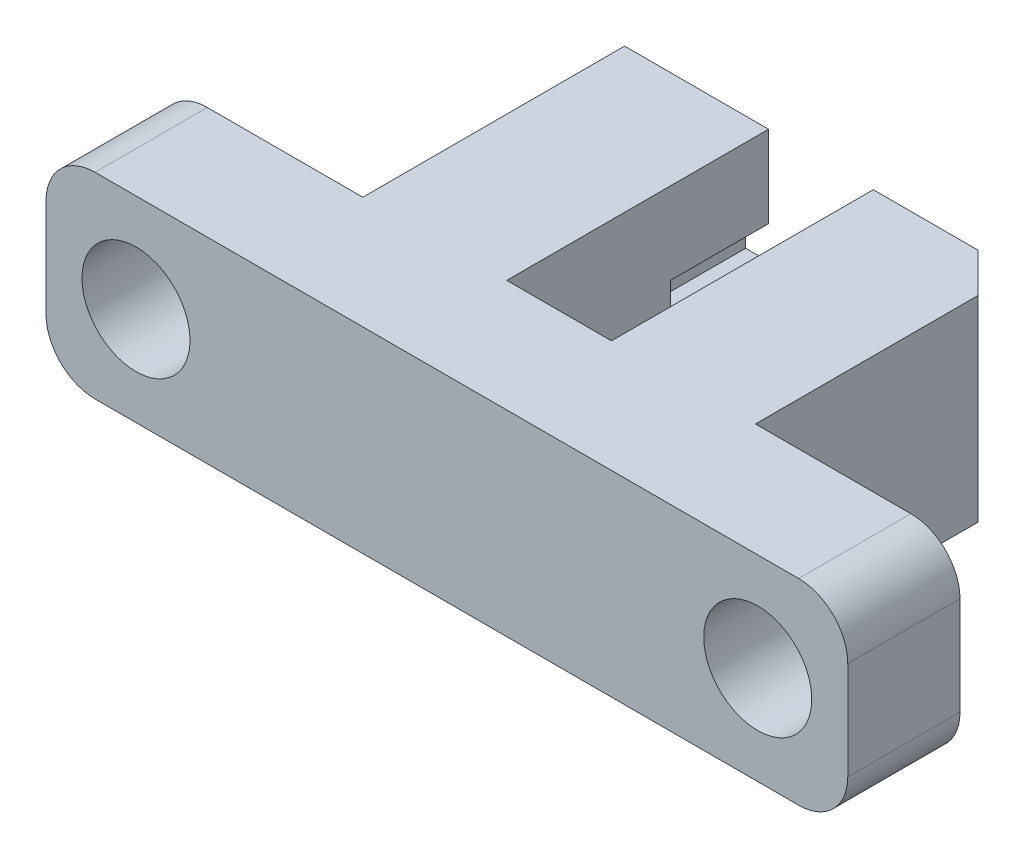
ISO-10303-21;
HEADER;
FILE_DESCRIPTION(('STEP AP214'),'2;1');
FILE_NAME('part.step','',(''),(''),'','','');
FILE_SCHEMA(('AUTOMOTIVE_DESIGN { 1 0 10303 214 1 1 1 1 }'));
ENDSEC;
DATA;
#1=APPLICATION_CONTEXT('core data for automotive mechanical design processes');
#2=APPLICATION_PROTOCOL_DEFINITION('international standard','automotive_design',2000,#1);
#3=PRODUCT_CONTEXT('',#1,'mechanical');
#4=PRODUCT('Part','Part','',(#3));
#5=PRODUCT_RELATED_PRODUCT_CATEGORY('part','',(#4));
#6=PRODUCT_DEFINITION_FORMATION('','',#4);
#7=PRODUCT_DEFINITION_CONTEXT('part definition',#1,'design');
#8=PRODUCT_DEFINITION('design','',#6,#7);
#9=PRODUCT_DEFINITION_SHAPE('','',#8);
#10=(LENGTH_UNIT() NAMED_UNIT(*) SI_UNIT(.MILLI.,.METRE.));
#11=(NAMED_UNIT(*) PLANE_ANGLE_UNIT() SI_UNIT($,.RADIAN.));
#12=(NAMED_UNIT(*) SI_UNIT($,.STERADIAN.) SOLID_ANGLE_UNIT());
#13=UNCERTAINTY_MEASURE_WITH_UNIT(LENGTH_MEASURE(1.E-05),#10,'distance_accuracy_value','');
#14=(GEOMETRIC_REPRESENTATION_CONTEXT(3) GLOBAL_UNCERTAINTY_ASSIGNED_CONTEXT((#13)) GLOBAL_UNIT_ASSIGNED_CONTEXT((#10,
#11,#12)) REPRESENTATION_CONTEXT('',''));
#15=CARTESIAN_POINT('',(0.,0.,0.));
#16=DIRECTION('',(0.,0.,1.));
#17=DIRECTION('',(1.,0.,0.));
#18=AXIS2_PLACEMENT_3D('',#15,#16,#17);
#19=CARTESIAN_POINT('',(6.15,-0.5,-11.43));
#20=DIRECTION('',(1.,0.,0.));
#21=DIRECTION('',(0.,0.,-1.));
#22=AXIS2_PLACEMENT_3D('',#19,#20,#21);
#23=PLANE('',#22);
#24=DIRECTION('',(0.,0.,-1.));
#25=VECTOR('',#24,1.);
#26=CARTESIAN_POINT('',(6.15,-0.5,-11.43));
#27=LINE('',#26,#25);
#28=CARTESIAN_POINT('',(6.15,-0.5,-11.43));
#29=VERTEX_POINT('',#28);
#30=CARTESIAN_POINT('',(6.15,-0.5,-8.43));
#31=VERTEX_POINT('',#30);
#32=EDGE_CURVE('E409',#29,#31,#27,.F.);
#33=ORIENTED_EDGE('',*,*,#32,.T.);
#34=DIRECTION('',(0.,1.,0.));
#35=VECTOR('',#34,1.);
#36=CARTESIAN_POINT('',(6.15,-0.5,-8.43));
#37=LINE('',#36,#35);
#38=CARTESIAN_POINT('',(6.15,0.5,-8.43));
#39=VERTEX_POINT('',#38);
#40=EDGE_CURVE('E440',#39,#31,#37,.F.);
#41=ORIENTED_EDGE('',*,*,#40,.F.);
#42=DIRECTION('',(0.,0.,1.));
#43=VECTOR('',#42,1.);
#44=CARTESIAN_POINT('',(6.15,0.5,-11.43));
#45=LINE('',#44,#43);
#46=CARTESIAN_POINT('',(6.15,0.5,-11.43));
#47=VERTEX_POINT('',#46);
#48=EDGE_CURVE('E393',#39,#47,#45,.F.);
#49=ORIENTED_EDGE('',*,*,#48,.T.);
#50=DIRECTION('',(0.,1.,0.));
#51=VECTOR('',#50,1.);
#52=CARTESIAN_POINT('',(6.15,-0.5,-11.43));
#53=LINE('',#52,#51);
#54=EDGE_CURVE('E433',#29,#47,#53,.T.);
#55=ORIENTED_EDGE('',*,*,#54,.F.);
#56=EDGE_LOOP('',(#33,#41,#49,#55));
#57=FACE_BOUND('',#56,.T.);
#58=ADVANCED_FACE('F16',(#57),#23,.F.);
#59=CARTESIAN_POINT('',(1.55,0.5,-11.43));
#60=DIRECTION('',(-1.,0.,0.));
#61=DIRECTION('',(0.,0.,1.));
#62=AXIS2_PLACEMENT_3D('',#59,#60,#61);
#63=PLANE('',#62);
#64=DIRECTION('',(0.,0.,1.));
#65=VECTOR('',#64,1.);
#66=CARTESIAN_POINT('',(1.55,0.5,-11.43));
#67=LINE('',#66,#65);
#68=CARTESIAN_POINT('',(1.55,0.5,-11.43));
#69=VERTEX_POINT('',#68);
#70=CARTESIAN_POINT('',(1.55,0.5,-8.43));
#71=VERTEX_POINT('',#70);
#72=EDGE_CURVE('E354',#69,#71,#67,.T.);
#73=ORIENTED_EDGE('',*,*,#72,.T.);
#74=DIRECTION('',(0.,1.,0.));
#75=VECTOR('',#74,1.);
#76=CARTESIAN_POINT('',(1.55,0.5,-8.43));
#77=LINE('',#76,#75);
#78=CARTESIAN_POINT('',(1.55,-0.5,-8.43));
#79=VERTEX_POINT('',#78);
#80=EDGE_CURVE('E431',#79,#71,#77,.T.);
#81=ORIENTED_EDGE('',*,*,#80,.F.);
#82=DIRECTION('',(0.,0.,-1.));
#83=VECTOR('',#82,1.);
#84=CARTESIAN_POINT('',(1.55,-0.5,-11.43));
#85=LINE('',#84,#83);
#86=CARTESIAN_POINT('',(1.55,-0.5,-11.43));
#87=VERTEX_POINT('',#86);
#88=EDGE_CURVE('E337',#79,#87,#85,.T.);
#89=ORIENTED_EDGE('',*,*,#88,.T.);
#90=DIRECTION('',(0.,1.,0.));
#91=VECTOR('',#90,1.);
#92=CARTESIAN_POINT('',(1.55,0.5,-11.43));
#93=LINE('',#92,#91);
#94=EDGE_CURVE('E414',#69,#87,#93,.F.);
#95=ORIENTED_EDGE('',*,*,#94,.F.);
#96=EDGE_LOOP('',(#73,#81,#89,#95));
#97=FACE_BOUND('',#96,.T.);
#98=ADVANCED_FACE('F604',(#97),#63,.F.);
#99=CARTESIAN_POINT('',(5.45,-0.5,-11.43));
#100=DIRECTION('',(0.,-1.,0.));
#101=DIRECTION('',(0.,0.,-1.));
#102=AXIS2_PLACEMENT_3D('',#99,#100,#101);
#103=PLANE('',#102);
#104=DIRECTION('',(0.,0.,1.));
#105=VECTOR('',#104,1.);
#106=CARTESIAN_POINT('',(5.45,-0.5,-3.43));
#107=LINE('',#106,#105);
#108=CARTESIAN_POINT('',(5.45,-0.5,-8.43));
#109=VERTEX_POINT('',#108);
#110=CARTESIAN_POINT('',(5.45,-0.5,-11.43));
#111=VERTEX_POINT('',#110);
#112=EDGE_CURVE('E375',#109,#111,#107,.F.);
#113=ORIENTED_EDGE('',*,*,#112,.F.);
#114=DIRECTION('',(1.,0.,0.));
#115=VECTOR('',#114,1.);
#116=CARTESIAN_POINT('',(5.8,-0.5,-8.43));
#117=LINE('',#116,#115);
#118=EDGE_CURVE('E389',#109,#31,#117,.T.);
#119=ORIENTED_EDGE('',*,*,#118,.T.);
#120=ORIENTED_EDGE('',*,*,#32,.F.);
#121=DIRECTION('',(-1.,0.,0.));
#122=VECTOR('',#121,1.);
#123=CARTESIAN_POINT('',(7.65,-0.5,-11.43));
#124=LINE('',#123,#122);
#125=EDGE_CURVE('E200',#111,#29,#124,.F.);
#126=ORIENTED_EDGE('',*,*,#125,.F.);
#127=EDGE_LOOP('',(#113,#119,#120,#126));
#128=FACE_BOUND('',#127,.T.);
#129=ADVANCED_FACE('F606',(#128),#103,.F.);
#130=CARTESIAN_POINT('',(6.15,0.5,-11.43));
#131=DIRECTION('',(0.,1.,0.));
#132=DIRECTION('',(-1.,0.,0.));
#133=AXIS2_PLACEMENT_3D('',#130,#131,#132);
#134=PLANE('',#133);
#135=ORIENTED_EDGE('',*,*,#48,.F.);
#136=DIRECTION('',(1.,0.,0.));
#137=VECTOR('',#136,1.);
#138=CARTESIAN_POINT('',(5.8,0.5,-8.43));
#139=LINE('',#138,#137);
#140=CARTESIAN_POINT('',(5.45,0.5,-8.43));
#141=VERTEX_POINT('',#140);
#142=EDGE_CURVE('E392',#39,#141,#139,.F.);
#143=ORIENTED_EDGE('',*,*,#142,.T.);
#144=DIRECTION('',(0.,0.,1.));
#145=VECTOR('',#144,1.);
#146=CARTESIAN_POINT('',(5.45,0.5,-3.43));
#147=LINE('',#146,#145);
#148=CARTESIAN_POINT('',(5.45,0.5,-11.43));
#149=VERTEX_POINT('',#148);
#150=EDGE_CURVE('E273',#149,#141,#147,.T.);
#151=ORIENTED_EDGE('',*,*,#150,.F.);
#152=DIRECTION('',(-1.,0.,0.));
#153=VECTOR('',#152,1.);
#154=CARTESIAN_POINT('',(7.65,0.5,-11.43));
#155=LINE('',#154,#153);
#156=EDGE_CURVE('E286',#47,#149,#155,.T.);
#157=ORIENTED_EDGE('',*,*,#156,.F.);
#158=EDGE_LOOP('',(#135,#143,#151,#157));
#159=FACE_BOUND('',#158,.T.);
#160=ADVANCED_FACE('F611',(#159),#134,.F.);
#161=CARTESIAN_POINT('',(5.8,0.,-8.43));
#162=DIRECTION('',(0.,0.,1.));
#163=DIRECTION('',(1.,0.,0.));
#164=AXIS2_PLACEMENT_3D('',#161,#162,#163);
#165=PLANE('',#164);
#166=ORIENTED_EDGE('',*,*,#142,.F.);
#167=ORIENTED_EDGE('',*,*,#40,.T.);
#168=ORIENTED_EDGE('',*,*,#118,.F.);
#169=DIRECTION('',(0.,1.,0.));
#170=VECTOR('',#169,1.);
#171=CARTESIAN_POINT('',(5.45,-3.,-8.43));
#172=LINE('',#171,#170);
#173=EDGE_CURVE('E348',#141,#109,#172,.F.);
#174=ORIENTED_EDGE('',*,*,#173,.F.);
#175=EDGE_LOOP('',(#166,#167,#168,#174));
#176=FACE_BOUND('',#175,.T.);
#177=ADVANCED_FACE('F618',(#176),#165,.F.);
#178=CARTESIAN_POINT('',(2.25,0.5,-11.43));
#179=DIRECTION('',(0.,1.,0.));
#180=DIRECTION('',(-1.,0.,0.));
#181=AXIS2_PLACEMENT_3D('',#178,#179,#180);
#182=PLANE('',#181);
#183=DIRECTION('',(0.,0.,-1.));
#184=VECTOR('',#183,1.);
#185=CARTESIAN_POINT('',(2.25,0.5,-3.43));
#186=LINE('',#185,#184);
#187=CARTESIAN_POINT('',(2.25,0.5,-8.43));
#188=VERTEX_POINT('',#187);
#189=CARTESIAN_POINT('',(2.25,0.5,-11.43));
#190=VERTEX_POINT('',#189);
#191=EDGE_CURVE('E252',#188,#190,#186,.T.);
#192=ORIENTED_EDGE('',*,*,#191,.F.);
#193=DIRECTION('',(1.,0.,0.));
#194=VECTOR('',#193,1.);
#195=CARTESIAN_POINT('',(1.9,0.5,-8.43));
#196=LINE('',#195,#194);
#197=EDGE_CURVE('E305',#188,#71,#196,.F.);
#198=ORIENTED_EDGE('',*,*,#197,.T.);
#199=ORIENTED_EDGE('',*,*,#72,.F.);
#200=DIRECTION('',(-1.,0.,0.));
#201=VECTOR('',#200,1.);
#202=CARTESIAN_POINT('',(2.25,0.5,-11.43));
#203=LINE('',#202,#201);
#204=EDGE_CURVE('E351',#190,#69,#203,.T.);
#205=ORIENTED_EDGE('',*,*,#204,.F.);
#206=EDGE_LOOP('',(#192,#198,#199,#205));
#207=FACE_BOUND('',#206,.T.);
#208=ADVANCED_FACE('F602',(#207),#182,.F.);
#209=CARTESIAN_POINT('',(1.55,-0.5,-11.43));
#210=DIRECTION('',(0.,-1.,0.));
#211=DIRECTION('',(0.,0.,-1.));
#212=AXIS2_PLACEMENT_3D('',#209,#210,#211);
#213=PLANE('',#212);
#214=ORIENTED_EDGE('',*,*,#88,.F.);
#215=DIRECTION('',(1.,0.,0.));
#216=VECTOR('',#215,1.);
#217=CARTESIAN_POINT('',(1.9,-0.5,-8.43));
#218=LINE('',#217,#216);
#219=CARTESIAN_POINT('',(2.25,-0.5,-8.43));
#220=VERTEX_POINT('',#219);
#221=EDGE_CURVE('E336',#79,#220,#218,.T.);
#222=ORIENTED_EDGE('',*,*,#221,.T.);
#223=DIRECTION('',(0.,0.,-1.));
#224=VECTOR('',#223,1.);
#225=CARTESIAN_POINT('',(2.25,-0.5,-3.43));
#226=LINE('',#225,#224);
#227=CARTESIAN_POINT('',(2.25,-0.5,-11.43));
#228=VERTEX_POINT('',#227);
#229=EDGE_CURVE('E327',#228,#220,#226,.F.);
#230=ORIENTED_EDGE('',*,*,#229,.F.);
#231=DIRECTION('',(1.,0.,0.));
#232=VECTOR('',#231,1.);
#233=CARTESIAN_POINT('',(1.55,-0.5,-11.43));
#234=LINE('',#233,#232);
#235=EDGE_CURVE('E334',#87,#228,#234,.T.);
#236=ORIENTED_EDGE('',*,*,#235,.F.);
#237=EDGE_LOOP('',(#214,#222,#230,#236));
#238=FACE_BOUND('',#237,.T.);
#239=ADVANCED_FACE('F595',(#238),#213,.F.);
#240=CARTESIAN_POINT('',(1.9,0.,-8.43));
#241=DIRECTION('',(0.,0.,1.));
#242=DIRECTION('',(1.,0.,0.));
#243=AXIS2_PLACEMENT_3D('',#240,#241,#242);
#244=PLANE('',#243);
#245=DIRECTION('',(0.,1.,0.));
#246=VECTOR('',#245,1.);
#247=CARTESIAN_POINT('',(2.25,3.,-8.43));
#248=LINE('',#247,#246);
#249=EDGE_CURVE('E323',#220,#188,#248,.T.);
#250=ORIENTED_EDGE('',*,*,#249,.F.);
#251=ORIENTED_EDGE('',*,*,#221,.F.);
#252=ORIENTED_EDGE('',*,*,#80,.T.);
#253=ORIENTED_EDGE('',*,*,#197,.F.);
#254=EDGE_LOOP('',(#250,#251,#252,#253));
#255=FACE_BOUND('',#254,.T.);
#256=ADVANCED_FACE('F599',(#255),#244,.F.);
#257=CARTESIAN_POINT('',(-8.4,-3.,0.));
#258=DIRECTION('',(-1.,0.,0.));
#259=DIRECTION('',(0.,0.,1.));
#260=AXIS2_PLACEMENT_3D('',#257,#258,#259);
#261=PLANE('',#260);
#262=DIRECTION('',(0.,0.,-1.));
#263=VECTOR('',#262,1.);
#264=CARTESIAN_POINT('',(-8.4,1.5,0.));
#265=LINE('',#264,#263);
#266=CARTESIAN_POINT('',(-8.4,1.5,-3.43));
#267=VERTEX_POINT('',#266);
#268=CARTESIAN_POINT('',(-8.4,1.5,0.));
#269=VERTEX_POINT('',#268);
#270=EDGE_CURVE('E306',#267,#269,#265,.F.);
#271=ORIENTED_EDGE('',*,*,#270,.F.);
#272=DIRECTION('',(0.,1.,0.));
#273=VECTOR('',#272,1.);
#274=CARTESIAN_POINT('',(-8.4,0.,-3.43));
#275=LINE('',#274,#273);
#276=CARTESIAN_POINT('',(-8.4,-1.5,-3.43));
#277=VERTEX_POINT('',#276);
#278=EDGE_CURVE('E178',#267,#277,#275,.F.);
#279=ORIENTED_EDGE('',*,*,#278,.T.);
#280=DIRECTION('',(0.,0.,-1.));
#281=VECTOR('',#280,1.);
#282=CARTESIAN_POINT('',(-8.4,-1.5,0.));
#283=LINE('',#282,#281);
#284=CARTESIAN_POINT('',(-8.4,-1.5,0.));
#285=VERTEX_POINT('',#284);
#286=EDGE_CURVE('E188',#285,#277,#283,.T.);
#287=ORIENTED_EDGE('',*,*,#286,.F.);
#288=DIRECTION('',(0.,1.,0.));
#289=VECTOR('',#288,1.);
#290=CARTESIAN_POINT('',(-8.4,0.,0.));
#291=LINE('',#290,#289);
#292=EDGE_CURVE('E471',#269,#285,#291,.F.);
#293=ORIENTED_EDGE('',*,*,#292,.F.);
#294=EDGE_LOOP('',(#271,#279,#287,#293));
#295=FACE_BOUND('',#294,.T.);
#296=ADVANCED_FACE('F629',(#295),#261,.T.);
#297=CARTESIAN_POINT('',(-6.9,-1.5,0.));
#298=DIRECTION('',(0.,0.,-1.));
#299=DIRECTION('',(-1.,0.,0.));
#300=AXIS2_PLACEMENT_3D('',#297,#298,#299);
#301=CYLINDRICAL_SURFACE('',#300,1.5);
#302=CARTESIAN_POINT('',(-6.9,-1.5,0.));
#303=DIRECTION('',(0.,0.,-1.));
#304=DIRECTION('',(-1.,0.,0.));
#305=AXIS2_PLACEMENT_3D('',#302,#303,#304);
#306=CIRCLE('',#305,1.5);
#307=CARTESIAN_POINT('',(-6.9,-3.,0.));
#308=VERTEX_POINT('',#307);
#309=EDGE_CURVE('E469',#285,#308,#306,.F.);
#310=ORIENTED_EDGE('',*,*,#309,.F.);
#311=ORIENTED_EDGE('',*,*,#286,.T.);
#312=CARTESIAN_POINT('',(-6.9,-1.5,-3.43));
#313=DIRECTION('',(0.,0.,-1.));
#314=DIRECTION('',(-1.,0.,0.));
#315=AXIS2_PLACEMENT_3D('',#312,#313,#314);
#316=CIRCLE('',#315,1.5);
#317=CARTESIAN_POINT('',(-6.9,-3.,-3.43));
#318=VERTEX_POINT('',#317);
#319=EDGE_CURVE('E19',#277,#318,#316,.F.);
#320=ORIENTED_EDGE('',*,*,#319,.T.);
#321=DIRECTION('',(0.,0.,-1.));
#322=VECTOR('',#321,1.);
#323=CARTESIAN_POINT('',(-6.9,-3.,0.));
#324=LINE('',#323,#322);
#325=EDGE_CURVE('E186',#308,#318,#324,.T.);
#326=ORIENTED_EDGE('',*,*,#325,.F.);
#327=EDGE_LOOP('',(#310,#311,#320,#326));
#328=FACE_BOUND('',#327,.T.);
#329=ADVANCED_FACE('F185',(#328),#301,.T.);
#330=CARTESIAN_POINT('',(-5.65,0.,0.));
#331=DIRECTION('',(0.,0.,-1.));
#332=DIRECTION('',(-1.,0.,0.));
#333=AXIS2_PLACEMENT_3D('',#330,#331,#332);
#334=CYLINDRICAL_SURFACE('',#333,1.65);
#335=CARTESIAN_POINT('',(-5.65,0.,0.));
#336=DIRECTION('',(0.,0.,-1.));
#337=DIRECTION('',(-1.,0.,0.));
#338=AXIS2_PLACEMENT_3D('',#335,#336,#337);
#339=CIRCLE('',#338,1.65);
#340=CARTESIAN_POINT('',(-7.3,0.,0.));
#341=VERTEX_POINT('',#340);
#342=EDGE_CURVE('E462',#341,#341,#339,.T.);
#343=ORIENTED_EDGE('',*,*,#342,.F.);
#344=EDGE_LOOP('',(#343));
#345=FACE_BOUND('',#344,.T.);
#346=CARTESIAN_POINT('',(-5.65,0.,-3.43));
#347=DIRECTION('',(0.,0.,-1.));
#348=DIRECTION('',(-1.,0.,0.));
#349=AXIS2_PLACEMENT_3D('',#346,#347,#348);
#350=CIRCLE('',#349,1.65);
#351=CARTESIAN_POINT('',(-7.3,0.,-3.43));
#352=VERTEX_POINT('',#351);
#353=EDGE_CURVE('E208',#352,#352,#350,.T.);
#354=ORIENTED_EDGE('',*,*,#353,.T.);
#355=EDGE_LOOP('',(#354));
#356=FACE_BOUND('',#355,.T.);
#357=ADVANCED_FACE('F478',(#345,#356),#334,.F.);
#358=CARTESIAN_POINT('',(14.6,-1.5,0.));
#359=DIRECTION('',(0.,0.,-1.));
#360=DIRECTION('',(-1.,0.,0.));
#361=AXIS2_PLACEMENT_3D('',#358,#359,#360);
#362=CYLINDRICAL_SURFACE('',#361,1.5);
#363=CARTESIAN_POINT('',(14.6,-1.5,0.));
#364=DIRECTION('',(0.,0.,-1.));
#365=DIRECTION('',(-1.,0.,0.));
#366=AXIS2_PLACEMENT_3D('',#363,#364,#365);
#367=CIRCLE('',#366,1.5);
#368=CARTESIAN_POINT('',(14.6,-3.,0.));
#369=VERTEX_POINT('',#368);
#370=CARTESIAN_POINT('',(16.1,-1.5,0.));
#371=VERTEX_POINT('',#370);
#372=EDGE_CURVE('E466',#369,#371,#367,.F.);
#373=ORIENTED_EDGE('',*,*,#372,.F.);
#374=DIRECTION('',(0.,0.,-1.));
#375=VECTOR('',#374,1.);
#376=CARTESIAN_POINT('',(14.6,-3.,0.));
#377=LINE('',#376,#375);
#378=CARTESIAN_POINT('',(14.6,-3.,-3.43));
#379=VERTEX_POINT('',#378);
#380=EDGE_CURVE('E201',#379,#369,#377,.F.);
#381=ORIENTED_EDGE('',*,*,#380,.F.);
#382=CARTESIAN_POINT('',(14.6,-1.5,-3.43));
#383=DIRECTION('',(0.,0.,-1.));
#384=DIRECTION('',(-1.,0.,0.));
#385=AXIS2_PLACEMENT_3D('',#382,#383,#384);
#386=CIRCLE('',#385,1.5);
#387=CARTESIAN_POINT('',(16.1,-1.5,-3.43));
#388=VERTEX_POINT('',#387);
#389=EDGE_CURVE('E455',#379,#388,#386,.F.);
#390=ORIENTED_EDGE('',*,*,#389,.T.);
#391=DIRECTION('',(0.,0.,1.));
#392=VECTOR('',#391,1.);
#393=CARTESIAN_POINT('',(16.1,-1.5,0.));
#394=LINE('',#393,#392);
#395=EDGE_CURVE('E298',#371,#388,#394,.F.);
#396=ORIENTED_EDGE('',*,*,#395,.F.);
#397=EDGE_LOOP('',(#373,#381,#390,#396));
#398=FACE_BOUND('',#397,.T.);
#399=ADVANCED_FACE('F527',(#398),#362,.T.);
#400=CARTESIAN_POINT('',(16.1,3.,0.));
#401=DIRECTION('',(1.,0.,0.));
#402=DIRECTION('',(0.,1.,0.));
#403=AXIS2_PLACEMENT_3D('',#400,#401,#402);
#404=PLANE('',#403);
#405=ORIENTED_EDGE('',*,*,#395,.T.);
#406=DIRECTION('',(0.,1.,0.));
#407=VECTOR('',#406,1.);
#408=CARTESIAN_POINT('',(16.1,0.,-3.43));
#409=LINE('',#408,#407);
#410=CARTESIAN_POINT('',(16.1,1.5,-3.43));
#411=VERTEX_POINT('',#410);
#412=EDGE_CURVE('E454',#388,#411,#409,.T.);
#413=ORIENTED_EDGE('',*,*,#412,.T.);
#414=DIRECTION('',(0.,0.,-1.));
#415=VECTOR('',#414,1.);
#416=CARTESIAN_POINT('',(16.1,1.5,0.));
#417=LINE('',#416,#415);
#418=CARTESIAN_POINT('',(16.1,1.5,0.));
#419=VERTEX_POINT('',#418);
#420=EDGE_CURVE('E293',#419,#411,#417,.T.);
#421=ORIENTED_EDGE('',*,*,#420,.F.);
#422=DIRECTION('',(0.,1.,0.));
#423=VECTOR('',#422,1.);
#424=CARTESIAN_POINT('',(16.1,0.,0.));
#425=LINE('',#424,#423);
#426=EDGE_CURVE('E465',#371,#419,#425,.T.);
#427=ORIENTED_EDGE('',*,*,#426,.F.);
#428=EDGE_LOOP('',(#405,#413,#421,#427));
#429=FACE_BOUND('',#428,.T.);
#430=ADVANCED_FACE('F532',(#429),#404,.T.);
#431=CARTESIAN_POINT('',(13.35,0.,0.));
#432=DIRECTION('',(0.,0.,-1.));
#433=DIRECTION('',(-1.,0.,0.));
#434=AXIS2_PLACEMENT_3D('',#431,#432,#433);
#435=CYLINDRICAL_SURFACE('',#434,1.65);
#436=CARTESIAN_POINT('',(13.35,0.,0.));
#437=DIRECTION('',(0.,0.,-1.));
#438=DIRECTION('',(-1.,0.,0.));
#439=AXIS2_PLACEMENT_3D('',#436,#437,#438);
#440=CIRCLE('',#439,1.65);
#441=CARTESIAN_POINT('',(11.7,0.,0.));
#442=VERTEX_POINT('',#441);
#443=EDGE_CURVE('E459',#442,#442,#440,.T.);
#444=ORIENTED_EDGE('',*,*,#443,.F.);
#445=EDGE_LOOP('',(#444));
#446=FACE_BOUND('',#445,.T.);
#447=CARTESIAN_POINT('',(13.35,0.,-3.43));
#448=DIRECTION('',(0.,0.,-1.));
#449=DIRECTION('',(-1.,0.,0.));
#450=AXIS2_PLACEMENT_3D('',#447,#448,#449);
#451=CIRCLE('',#450,1.65);
#452=CARTESIAN_POINT('',(11.7,0.,-3.43));
#453=VERTEX_POINT('',#452);
#454=EDGE_CURVE('E420',#453,#453,#451,.T.);
#455=ORIENTED_EDGE('',*,*,#454,.T.);
#456=EDGE_LOOP('',(#455));
#457=FACE_BOUND('',#456,.T.);
#458=ADVANCED_FACE('F641',(#446,#457),#435,.F.);
#459=CARTESIAN_POINT('',(9.25,1.5,-10.83));
#460=DIRECTION('',(0.707106781186547,0.,-0.707106781186548));
#461=DIRECTION('',(-0.707106781186548,0.,-0.707106781186547));
#462=AXIS2_PLACEMENT_3D('',#459,#460,#461);
#463=PLANE('',#462);
#464=DIRECTION('',(-0.707106781186548,0.,-0.707106781186547));
#465=VECTOR('',#464,1.);
#466=CARTESIAN_POINT('',(9.25,3.,-10.83));
#467=LINE('',#466,#465);
#468=CARTESIAN_POINT('',(8.65,3.,-11.43));
#469=VERTEX_POINT('',#468);
#470=CARTESIAN_POINT('',(9.85,3.,-10.23));
#471=VERTEX_POINT('',#470);
#472=EDGE_CURVE('E301',#469,#471,#467,.F.);
#473=ORIENTED_EDGE('',*,*,#472,.T.);
#474=DIRECTION('',(0.,1.,0.));
#475=VECTOR('',#474,1.);
#476=CARTESIAN_POINT('',(9.85,3.,-10.23));
#477=LINE('',#476,#475);
#478=CARTESIAN_POINT('',(9.85,-3.,-10.23));
#479=VERTEX_POINT('',#478);
#480=EDGE_CURVE('E417',#479,#471,#477,.T.);
#481=ORIENTED_EDGE('',*,*,#480,.F.);
#482=DIRECTION('',(0.707106781186548,0.,0.707106781186547));
#483=VECTOR('',#482,1.);
#484=CARTESIAN_POINT('',(8.65,-3.,-11.43));
#485=LINE('',#484,#483);
#486=CARTESIAN_POINT('',(8.65,-3.,-11.43));
#487=VERTEX_POINT('',#486);
#488=EDGE_CURVE('E302',#487,#479,#485,.T.);
#489=ORIENTED_EDGE('',*,*,#488,.F.);
#490=DIRECTION('',(0.,1.,0.));
#491=VECTOR('',#490,1.);
#492=CARTESIAN_POINT('',(8.65,0.,-11.43));
#493=LINE('',#492,#491);
#494=EDGE_CURVE('E282',#469,#487,#493,.F.);
#495=ORIENTED_EDGE('',*,*,#494,.F.);
#496=EDGE_LOOP('',(#473,#481,#489,#495));
#497=FACE_BOUND('',#496,.T.);
#498=ADVANCED_FACE('F569',(#497),#463,.T.);
#499=CARTESIAN_POINT('',(16.1,-3.,0.));
#500=DIRECTION('',(0.,-1.,0.));
#501=DIRECTION('',(0.,0.,-1.));
#502=AXIS2_PLACEMENT_3D('',#499,#500,#501);
#503=PLANE('',#502);
#504=DIRECTION('',(0.,0.,1.));
#505=VECTOR('',#504,1.);
#506=CARTESIAN_POINT('',(5.45,-3.,-3.43));
#507=LINE('',#506,#505);
#508=CARTESIAN_POINT('',(5.45,-3.,-11.43));
#509=VERTEX_POINT('',#508);
#510=CARTESIAN_POINT('',(5.45,-3.,-3.43));
#511=VERTEX_POINT('',#510);
#512=EDGE_CURVE('E274',#509,#511,#507,.T.);
#513=ORIENTED_EDGE('',*,*,#512,.F.);
#514=DIRECTION('',(-1.,0.,0.));
#515=VECTOR('',#514,1.);
#516=CARTESIAN_POINT('',(7.65,-3.,-11.43));
#517=LINE('',#516,#515);
#518=EDGE_CURVE('E285',#487,#509,#517,.T.);
#519=ORIENTED_EDGE('',*,*,#518,.F.);
#520=ORIENTED_EDGE('',*,*,#488,.T.);
#521=DIRECTION('',(0.,0.,-1.));
#522=VECTOR('',#521,1.);
#523=CARTESIAN_POINT('',(9.85,-3.,-3.43));
#524=LINE('',#523,#522);
#525=CARTESIAN_POINT('',(9.85,-3.,-3.43));
#526=VERTEX_POINT('',#525);
#527=EDGE_CURVE('E279',#526,#479,#524,.T.);
#528=ORIENTED_EDGE('',*,*,#527,.F.);
#529=DIRECTION('',(1.,0.,0.));
#530=VECTOR('',#529,1.);
#531=CARTESIAN_POINT('',(3.85,-3.,-3.43));
#532=LINE('',#531,#530);
#533=EDGE_CURVE('E296',#526,#379,#532,.T.);
#534=ORIENTED_EDGE('',*,*,#533,.T.);
#535=ORIENTED_EDGE('',*,*,#380,.T.);
#536=DIRECTION('',(1.,0.,0.));
#537=VECTOR('',#536,1.);
#538=CARTESIAN_POINT('',(3.85,-3.,0.));
#539=LINE('',#538,#537);
#540=EDGE_CURVE('E198',#308,#369,#539,.T.);
#541=ORIENTED_EDGE('',*,*,#540,.F.);
#542=ORIENTED_EDGE('',*,*,#325,.T.);
#543=DIRECTION('',(1.,0.,0.));
#544=VECTOR('',#543,1.);
#545=CARTESIAN_POINT('',(3.85,-3.,-3.43));
#546=LINE('',#545,#544);
#547=CARTESIAN_POINT('',(-2.15,-3.,-3.43));
#548=VERTEX_POINT('',#547);
#549=EDGE_CURVE('E191',#318,#548,#546,.T.);
#550=ORIENTED_EDGE('',*,*,#549,.T.);
#551=DIRECTION('',(0.,0.,1.));
#552=VECTOR('',#551,1.);
#553=CARTESIAN_POINT('',(-2.15,-3.,-3.43));
#554=LINE('',#553,#552);
#555=CARTESIAN_POINT('',(-2.15,-3.,-11.43));
#556=VERTEX_POINT('',#555);
#557=EDGE_CURVE('E216',#556,#548,#554,.T.);
#558=ORIENTED_EDGE('',*,*,#557,.F.);
#559=DIRECTION('',(-1.,0.,0.));
#560=VECTOR('',#559,1.);
#561=CARTESIAN_POINT('',(0.0500000000000017,-3.,-11.43));
#562=LINE('',#561,#560);
#563=CARTESIAN_POINT('',(2.25,-3.,-11.43));
#564=VERTEX_POINT('',#563);
#565=EDGE_CURVE('E240',#564,#556,#562,.T.);
#566=ORIENTED_EDGE('',*,*,#565,.F.);
#567=DIRECTION('',(0.,0.,-1.));
#568=VECTOR('',#567,1.);
#569=CARTESIAN_POINT('',(2.25,-3.,-3.43));
#570=LINE('',#569,#568);
#571=CARTESIAN_POINT('',(2.25,-3.,-3.43));
#572=VERTEX_POINT('',#571);
#573=EDGE_CURVE('E251',#572,#564,#570,.T.);
#574=ORIENTED_EDGE('',*,*,#573,.F.);
#575=DIRECTION('',(1.,0.,0.));
#576=VECTOR('',#575,1.);
#577=CARTESIAN_POINT('',(3.85,-3.,-3.43));
#578=LINE('',#577,#576);
#579=EDGE_CURVE('E262',#572,#511,#578,.T.);
#580=ORIENTED_EDGE('',*,*,#579,.T.);
#581=EDGE_LOOP('',(#513,#519,#520,#528,#534,#535,#541,#542,#550,#558,#566,#574,#580));
#582=FACE_BOUND('',#581,.T.);
#583=ADVANCED_FACE('F194',(#582),#503,.T.);
#584=CARTESIAN_POINT('',(7.65,0.,-11.43));
#585=DIRECTION('',(0.,0.,-1.));
#586=DIRECTION('',(-1.,0.,0.));
#587=AXIS2_PLACEMENT_3D('',#584,#585,#586);
#588=PLANE('',#587);
#589=ORIENTED_EDGE('',*,*,#518,.T.);
#590=DIRECTION('',(0.,1.,0.));
#591=VECTOR('',#590,1.);
#592=CARTESIAN_POINT('',(5.45,-3.,-11.43));
#593=LINE('',#592,#591);
#594=EDGE_CURVE('E363',#111,#509,#593,.F.);
#595=ORIENTED_EDGE('',*,*,#594,.F.);
#596=ORIENTED_EDGE('',*,*,#125,.T.);
#597=ORIENTED_EDGE('',*,*,#54,.T.);
#598=ORIENTED_EDGE('',*,*,#156,.T.);
#599=DIRECTION('',(0.,1.,0.));
#600=VECTOR('',#599,1.);
#601=CARTESIAN_POINT('',(5.45,-3.,-11.43));
#602=LINE('',#601,#600);
#603=CARTESIAN_POINT('',(5.45,3.,-11.43));
#604=VERTEX_POINT('',#603);
#605=EDGE_CURVE('E270',#604,#149,#602,.F.);
#606=ORIENTED_EDGE('',*,*,#605,.F.);
#607=DIRECTION('',(-1.,0.,0.));
#608=VECTOR('',#607,1.);
#609=CARTESIAN_POINT('',(-8.4,3.,-11.43));
#610=LINE('',#609,#608);
#611=EDGE_CURVE('E267',#469,#604,#610,.T.);
#612=ORIENTED_EDGE('',*,*,#611,.F.);
#613=ORIENTED_EDGE('',*,*,#494,.T.);
#614=EDGE_LOOP('',(#589,#595,#596,#597,#598,#606,#612,#613));
#615=FACE_BOUND('',#614,.T.);
#616=ADVANCED_FACE('F573',(#615),#588,.T.);
#617=CARTESIAN_POINT('',(5.45,-3.,-3.43));
#618=DIRECTION('',(-1.,0.,0.));
#619=DIRECTION('',(0.,0.,1.));
#620=AXIS2_PLACEMENT_3D('',#617,#618,#619);
#621=PLANE('',#620);
#622=ORIENTED_EDGE('',*,*,#150,.T.);
#623=ORIENTED_EDGE('',*,*,#173,.T.);
#624=ORIENTED_EDGE('',*,*,#112,.T.);
#625=ORIENTED_EDGE('',*,*,#594,.T.);
#626=ORIENTED_EDGE('',*,*,#512,.T.);
#627=DIRECTION('',(0.,1.,0.));
#628=VECTOR('',#627,1.);
#629=CARTESIAN_POINT('',(5.45,0.,-3.43));
#630=LINE('',#629,#628);
#631=CARTESIAN_POINT('',(5.45,3.,-3.43));
#632=VERTEX_POINT('',#631);
#633=EDGE_CURVE('E260',#511,#632,#630,.T.);
#634=ORIENTED_EDGE('',*,*,#633,.T.);
#635=DIRECTION('',(0.,0.,1.));
#636=VECTOR('',#635,1.);
#637=CARTESIAN_POINT('',(5.45,3.,0.));
#638=LINE('',#637,#636);
#639=EDGE_CURVE('E257',#604,#632,#638,.T.);
#640=ORIENTED_EDGE('',*,*,#639,.F.);
#641=ORIENTED_EDGE('',*,*,#605,.T.);
#642=EDGE_LOOP('',(#622,#623,#624,#625,#626,#634,#640,#641));
#643=FACE_BOUND('',#642,.T.);
#644=ADVANCED_FACE('F577',(#643),#621,.T.);
#645=CARTESIAN_POINT('',(3.85,0.,-3.43));
#646=DIRECTION('',(0.,0.,1.));
#647=DIRECTION('',(1.,0.,0.));
#648=AXIS2_PLACEMENT_3D('',#645,#646,#647);
#649=PLANE('',#648);
#650=ORIENTED_EDGE('',*,*,#579,.F.);
#651=DIRECTION('',(0.,1.,0.));
#652=VECTOR('',#651,1.);
#653=CARTESIAN_POINT('',(2.25,3.,-3.43));
#654=LINE('',#653,#652);
#655=CARTESIAN_POINT('',(2.25,3.,-3.43));
#656=VERTEX_POINT('',#655);
#657=EDGE_CURVE('E248',#656,#572,#654,.F.);
#658=ORIENTED_EDGE('',*,*,#657,.F.);
#659=DIRECTION('',(-1.,0.,0.));
#660=VECTOR('',#659,1.);
#661=CARTESIAN_POINT('',(-8.4,3.,-3.43));
#662=LINE('',#661,#660);
#663=EDGE_CURVE('E245',#632,#656,#662,.T.);
#664=ORIENTED_EDGE('',*,*,#663,.F.);
#665=ORIENTED_EDGE('',*,*,#633,.F.);
#666=EDGE_LOOP('',(#650,#658,#664,#665));
#667=FACE_BOUND('',#666,.T.);
#668=ADVANCED_FACE('F581',(#667),#649,.F.);
#669=CARTESIAN_POINT('',(2.25,3.,-3.43));
#670=DIRECTION('',(1.,0.,0.));
#671=DIRECTION('',(0.,0.,-1.));
#672=AXIS2_PLACEMENT_3D('',#669,#670,#671);
#673=PLANE('',#672);
#674=ORIENTED_EDGE('',*,*,#229,.T.);
#675=ORIENTED_EDGE('',*,*,#249,.T.);
#676=ORIENTED_EDGE('',*,*,#191,.T.);
#677=DIRECTION('',(0.,1.,0.));
#678=VECTOR('',#677,1.);
#679=CARTESIAN_POINT('',(2.25,0.,-11.43));
#680=LINE('',#679,#678);
#681=CARTESIAN_POINT('',(2.25,3.,-11.43));
#682=VERTEX_POINT('',#681);
#683=EDGE_CURVE('E230',#682,#190,#680,.F.);
#684=ORIENTED_EDGE('',*,*,#683,.F.);
#685=DIRECTION('',(0.,0.,1.));
#686=VECTOR('',#685,1.);
#687=CARTESIAN_POINT('',(2.25,3.,0.));
#688=LINE('',#687,#686);
#689=EDGE_CURVE('E235',#656,#682,#688,.F.);
#690=ORIENTED_EDGE('',*,*,#689,.F.);
#691=ORIENTED_EDGE('',*,*,#657,.T.);
#692=ORIENTED_EDGE('',*,*,#573,.T.);
#693=DIRECTION('',(0.,1.,0.));
#694=VECTOR('',#693,1.);
#695=CARTESIAN_POINT('',(2.25,0.,-11.43));
#696=LINE('',#695,#694);
#697=EDGE_CURVE('E314',#228,#564,#696,.F.);
#698=ORIENTED_EDGE('',*,*,#697,.F.);
#699=EDGE_LOOP('',(#674,#675,#676,#684,#690,#691,#692,#698));
#700=FACE_BOUND('',#699,.T.);
#701=ADVANCED_FACE('F585',(#700),#673,.T.);
#702=CARTESIAN_POINT('',(0.0500000000000017,0.,-11.43));
#703=DIRECTION('',(0.,0.,-1.));
#704=DIRECTION('',(-1.,0.,0.));
#705=AXIS2_PLACEMENT_3D('',#702,#703,#704);
#706=PLANE('',#705);
#707=DIRECTION('',(-1.,0.,0.));
#708=VECTOR('',#707,1.);
#709=CARTESIAN_POINT('',(-8.4,3.,-11.43));
#710=LINE('',#709,#708);
#711=CARTESIAN_POINT('',(-2.15,3.,-11.43));
#712=VERTEX_POINT('',#711);
#713=EDGE_CURVE('E224',#682,#712,#710,.T.);
#714=ORIENTED_EDGE('',*,*,#713,.F.);
#715=ORIENTED_EDGE('',*,*,#683,.T.);
#716=ORIENTED_EDGE('',*,*,#204,.T.);
#717=ORIENTED_EDGE('',*,*,#94,.T.);
#718=ORIENTED_EDGE('',*,*,#235,.T.);
#719=ORIENTED_EDGE('',*,*,#697,.T.);
#720=ORIENTED_EDGE('',*,*,#565,.T.);
#721=DIRECTION('',(0.,1.,0.));
#722=VECTOR('',#721,1.);
#723=CARTESIAN_POINT('',(-2.15,-3.,-11.43));
#724=LINE('',#723,#722);
#725=EDGE_CURVE('E227',#712,#556,#724,.F.);
#726=ORIENTED_EDGE('',*,*,#725,.F.);
#727=EDGE_LOOP('',(#714,#715,#716,#717,#718,#719,#720,#726));
#728=FACE_BOUND('',#727,.T.);
#729=ADVANCED_FACE('F492',(#728),#706,.T.);
#730=CARTESIAN_POINT('',(-2.15,-3.,-3.43));
#731=DIRECTION('',(-1.,0.,0.));
#732=DIRECTION('',(0.,0.,1.));
#733=AXIS2_PLACEMENT_3D('',#730,#731,#732);
#734=PLANE('',#733);
#735=ORIENTED_EDGE('',*,*,#725,.T.);
#736=ORIENTED_EDGE('',*,*,#557,.T.);
#737=DIRECTION('',(0.,1.,0.));
#738=VECTOR('',#737,1.);
#739=CARTESIAN_POINT('',(-2.15,0.,-3.43));
#740=LINE('',#739,#738);
#741=CARTESIAN_POINT('',(-2.15,3.,-3.43));
#742=VERTEX_POINT('',#741);
#743=EDGE_CURVE('E206',#548,#742,#740,.T.);
#744=ORIENTED_EDGE('',*,*,#743,.T.);
#745=DIRECTION('',(0.,0.,1.));
#746=VECTOR('',#745,1.);
#747=CARTESIAN_POINT('',(-2.15,3.,0.));
#748=LINE('',#747,#746);
#749=EDGE_CURVE('E220',#712,#742,#748,.T.);
#750=ORIENTED_EDGE('',*,*,#749,.F.);
#751=EDGE_LOOP('',(#735,#736,#744,#750));
#752=FACE_BOUND('',#751,.T.);
#753=ADVANCED_FACE('F482',(#752),#734,.T.);
#754=CARTESIAN_POINT('',(3.85,0.,-3.43));
#755=DIRECTION('',(0.,0.,1.));
#756=DIRECTION('',(1.,0.,0.));
#757=AXIS2_PLACEMENT_3D('',#754,#755,#756);
#758=PLANE('',#757);
#759=ORIENTED_EDGE('',*,*,#353,.F.);
#760=EDGE_LOOP('',(#759));
#761=FACE_BOUND('',#760,.T.);
#762=ORIENTED_EDGE('',*,*,#549,.F.);
#763=ORIENTED_EDGE('',*,*,#319,.F.);
#764=ORIENTED_EDGE('',*,*,#278,.F.);
#765=CARTESIAN_POINT('',(-6.9,1.5,-3.43));
#766=DIRECTION('',(0.,0.,-1.));
#767=DIRECTION('',(-1.,0.,0.));
#768=AXIS2_PLACEMENT_3D('',#765,#766,#767);
#769=CIRCLE('',#768,1.5);
#770=CARTESIAN_POINT('',(-6.9,3.,-3.43));
#771=VERTEX_POINT('',#770);
#772=EDGE_CURVE('E309',#771,#267,#769,.F.);
#773=ORIENTED_EDGE('',*,*,#772,.F.);
#774=DIRECTION('',(-1.,0.,0.));
#775=VECTOR('',#774,1.);
#776=CARTESIAN_POINT('',(-8.4,3.,-3.43));
#777=LINE('',#776,#775);
#778=EDGE_CURVE('E223',#742,#771,#777,.T.);
#779=ORIENTED_EDGE('',*,*,#778,.F.);
#780=ORIENTED_EDGE('',*,*,#743,.F.);
#781=EDGE_LOOP('',(#762,#763,#764,#773,#779,#780));
#782=FACE_BOUND('',#781,.T.);
#783=ADVANCED_FACE('F204',(#761,#782),#758,.F.);
#784=CARTESIAN_POINT('',(-6.9,1.5,0.));
#785=DIRECTION('',(0.,0.,-1.));
#786=DIRECTION('',(-1.,0.,0.));
#787=AXIS2_PLACEMENT_3D('',#784,#785,#786);
#788=CYLINDRICAL_SURFACE('',#787,1.5);
#789=CARTESIAN_POINT('',(-6.9,1.5,0.));
#790=DIRECTION('',(0.,0.,-1.));
#791=DIRECTION('',(-1.,0.,0.));
#792=AXIS2_PLACEMENT_3D('',#789,#790,#791);
#793=CIRCLE('',#792,1.5);
#794=CARTESIAN_POINT('',(-6.9,3.,0.));
#795=VERTEX_POINT('',#794);
#796=EDGE_CURVE('E308',#795,#269,#793,.F.);
#797=ORIENTED_EDGE('',*,*,#796,.F.);
#798=DIRECTION('',(0.,0.,1.));
#799=VECTOR('',#798,1.);
#800=CARTESIAN_POINT('',(-6.9,3.,0.));
#801=LINE('',#800,#799);
#802=EDGE_CURVE('E541',#771,#795,#801,.T.);
#803=ORIENTED_EDGE('',*,*,#802,.F.);
#804=ORIENTED_EDGE('',*,*,#772,.T.);
#805=ORIENTED_EDGE('',*,*,#270,.T.);
#806=EDGE_LOOP('',(#797,#803,#804,#805));
#807=FACE_BOUND('',#806,.T.);
#808=ADVANCED_FACE('F481',(#807),#788,.T.);
#809=CARTESIAN_POINT('',(3.85,0.,0.));
#810=DIRECTION('',(0.,0.,1.));
#811=DIRECTION('',(1.,0.,0.));
#812=AXIS2_PLACEMENT_3D('',#809,#810,#811);
#813=PLANE('',#812);
#814=ORIENTED_EDGE('',*,*,#443,.T.);
#815=EDGE_LOOP('',(#814));
#816=FACE_BOUND('',#815,.T.);
#817=ORIENTED_EDGE('',*,*,#342,.T.);
#818=EDGE_LOOP('',(#817));
#819=FACE_BOUND('',#818,.T.);
#820=ORIENTED_EDGE('',*,*,#372,.T.);
#821=ORIENTED_EDGE('',*,*,#426,.T.);
#822=CARTESIAN_POINT('',(14.6,1.5,0.));
#823=DIRECTION('',(0.,0.,-1.));
#824=DIRECTION('',(-1.,0.,0.));
#825=AXIS2_PLACEMENT_3D('',#822,#823,#824);
#826=CIRCLE('',#825,1.5);
#827=CARTESIAN_POINT('',(14.6,3.,0.));
#828=VERTEX_POINT('',#827);
#829=EDGE_CURVE('E297',#828,#419,#826,.T.);
#830=ORIENTED_EDGE('',*,*,#829,.F.);
#831=DIRECTION('',(-1.,0.,0.));
#832=VECTOR('',#831,1.);
#833=CARTESIAN_POINT('',(-8.4,3.,0.));
#834=LINE('',#833,#832);
#835=EDGE_CURVE('E536',#795,#828,#834,.F.);
#836=ORIENTED_EDGE('',*,*,#835,.F.);
#837=ORIENTED_EDGE('',*,*,#796,.T.);
#838=ORIENTED_EDGE('',*,*,#292,.T.);
#839=ORIENTED_EDGE('',*,*,#309,.T.);
#840=ORIENTED_EDGE('',*,*,#540,.T.);
#841=EDGE_LOOP('',(#820,#821,#830,#836,#837,#838,#839,#840));
#842=FACE_BOUND('',#841,.T.);
#843=ADVANCED_FACE('F489',(#816,#819,#842),#813,.T.);
#844=CARTESIAN_POINT('',(14.6,1.5,0.));
#845=DIRECTION('',(0.,0.,-1.));
#846=DIRECTION('',(-1.,0.,0.));
#847=AXIS2_PLACEMENT_3D('',#844,#845,#846);
#848=CYLINDRICAL_SURFACE('',#847,1.5);
#849=ORIENTED_EDGE('',*,*,#829,.T.);
#850=ORIENTED_EDGE('',*,*,#420,.T.);
#851=CARTESIAN_POINT('',(14.6,1.5,-3.43));
#852=DIRECTION('',(0.,0.,-1.));
#853=DIRECTION('',(-1.,0.,0.));
#854=AXIS2_PLACEMENT_3D('',#851,#852,#853);
#855=CIRCLE('',#854,1.5);
#856=CARTESIAN_POINT('',(14.6,3.,-3.43));
#857=VERTEX_POINT('',#856);
#858=EDGE_CURVE('E452',#411,#857,#855,.F.);
#859=ORIENTED_EDGE('',*,*,#858,.T.);
#860=DIRECTION('',(0.,0.,1.));
#861=VECTOR('',#860,1.);
#862=CARTESIAN_POINT('',(14.6,3.,0.));
#863=LINE('',#862,#861);
#864=EDGE_CURVE('E551',#828,#857,#863,.F.);
#865=ORIENTED_EDGE('',*,*,#864,.F.);
#866=EDGE_LOOP('',(#849,#850,#859,#865));
#867=FACE_BOUND('',#866,.T.);
#868=ADVANCED_FACE('F510',(#867),#848,.T.);
#869=CARTESIAN_POINT('',(3.85,0.,-3.43));
#870=DIRECTION('',(0.,0.,1.));
#871=DIRECTION('',(1.,0.,0.));
#872=AXIS2_PLACEMENT_3D('',#869,#870,#871);
#873=PLANE('',#872);
#874=ORIENTED_EDGE('',*,*,#454,.F.);
#875=EDGE_LOOP('',(#874));
#876=FACE_BOUND('',#875,.T.);
#877=DIRECTION('',(-1.,0.,0.));
#878=VECTOR('',#877,1.);
#879=CARTESIAN_POINT('',(-8.4,3.,-3.43));
#880=LINE('',#879,#878);
#881=CARTESIAN_POINT('',(9.85,3.,-3.43));
#882=VERTEX_POINT('',#881);
#883=EDGE_CURVE('E25',#857,#882,#880,.T.);
#884=ORIENTED_EDGE('',*,*,#883,.F.);
#885=ORIENTED_EDGE('',*,*,#858,.F.);
#886=ORIENTED_EDGE('',*,*,#412,.F.);
#887=ORIENTED_EDGE('',*,*,#389,.F.);
#888=ORIENTED_EDGE('',*,*,#533,.F.);
#889=DIRECTION('',(0.,1.,0.));
#890=VECTOR('',#889,1.);
#891=CARTESIAN_POINT('',(9.85,3.,-3.43));
#892=LINE('',#891,#890);
#893=EDGE_CURVE('E34',#882,#526,#892,.F.);
#894=ORIENTED_EDGE('',*,*,#893,.F.);
#895=EDGE_LOOP('',(#884,#885,#886,#887,#888,#894));
#896=FACE_BOUND('',#895,.T.);
#897=ADVANCED_FACE('F503',(#876,#896),#873,.F.);
#898=CARTESIAN_POINT('',(9.85,3.,-3.43));
#899=DIRECTION('',(1.,0.,0.));
#900=DIRECTION('',(0.,0.,-1.));
#901=AXIS2_PLACEMENT_3D('',#898,#899,#900);
#902=PLANE('',#901);
#903=ORIENTED_EDGE('',*,*,#893,.T.);
#904=ORIENTED_EDGE('',*,*,#527,.T.);
#905=ORIENTED_EDGE('',*,*,#480,.T.);
#906=DIRECTION('',(0.,0.,1.));
#907=VECTOR('',#906,1.);
#908=CARTESIAN_POINT('',(9.85,3.,0.));
#909=LINE('',#908,#907);
#910=EDGE_CURVE('E11',#882,#471,#909,.F.);
#911=ORIENTED_EDGE('',*,*,#910,.F.);
#912=EDGE_LOOP('',(#903,#904,#905,#911));
#913=FACE_BOUND('',#912,.T.);
#914=ADVANCED_FACE('F497',(#913),#902,.T.);
#915=CARTESIAN_POINT('',(-8.4,3.,0.));
#916=DIRECTION('',(0.,1.,0.));
#917=DIRECTION('',(-1.,0.,0.));
#918=AXIS2_PLACEMENT_3D('',#915,#916,#917);
#919=PLANE('',#918);
#920=ORIENTED_EDGE('',*,*,#883,.T.);
#921=ORIENTED_EDGE('',*,*,#910,.T.);
#922=ORIENTED_EDGE('',*,*,#472,.F.);
#923=ORIENTED_EDGE('',*,*,#611,.T.);
#924=ORIENTED_EDGE('',*,*,#639,.T.);
#925=ORIENTED_EDGE('',*,*,#663,.T.);
#926=ORIENTED_EDGE('',*,*,#689,.T.);
#927=ORIENTED_EDGE('',*,*,#713,.T.);
#928=ORIENTED_EDGE('',*,*,#749,.T.);
#929=ORIENTED_EDGE('',*,*,#778,.T.);
#930=ORIENTED_EDGE('',*,*,#802,.T.);
#931=ORIENTED_EDGE('',*,*,#835,.T.);
#932=ORIENTED_EDGE('',*,*,#864,.T.);
#933=EDGE_LOOP('',(#920,#921,#922,#923,#924,#925,#926,#927,#928,#929,#930,#931,#932));
#934=FACE_BOUND('',#933,.T.);
#935=ADVANCED_FACE('F495',(#934),#919,.T.);
#936=CLOSED_SHELL('',(#58,#98,#129,#160,#177,#208,#239,#256,#296,#329,#357,#399,#430,#458,#498,
#583,#616,#644,#668,#701,#729,#753,#783,#808,#843,#868,#897,#914,#935));
#937=MANIFOLD_SOLID_BREP('B1',#936);
#938=ADVANCED_BREP_SHAPE_REPRESENTATION('',(#18,#937),#14);
#939=SHAPE_DEFINITION_REPRESENTATION(#9,#938);
ENDSEC;
END-ISO-10303-21;
